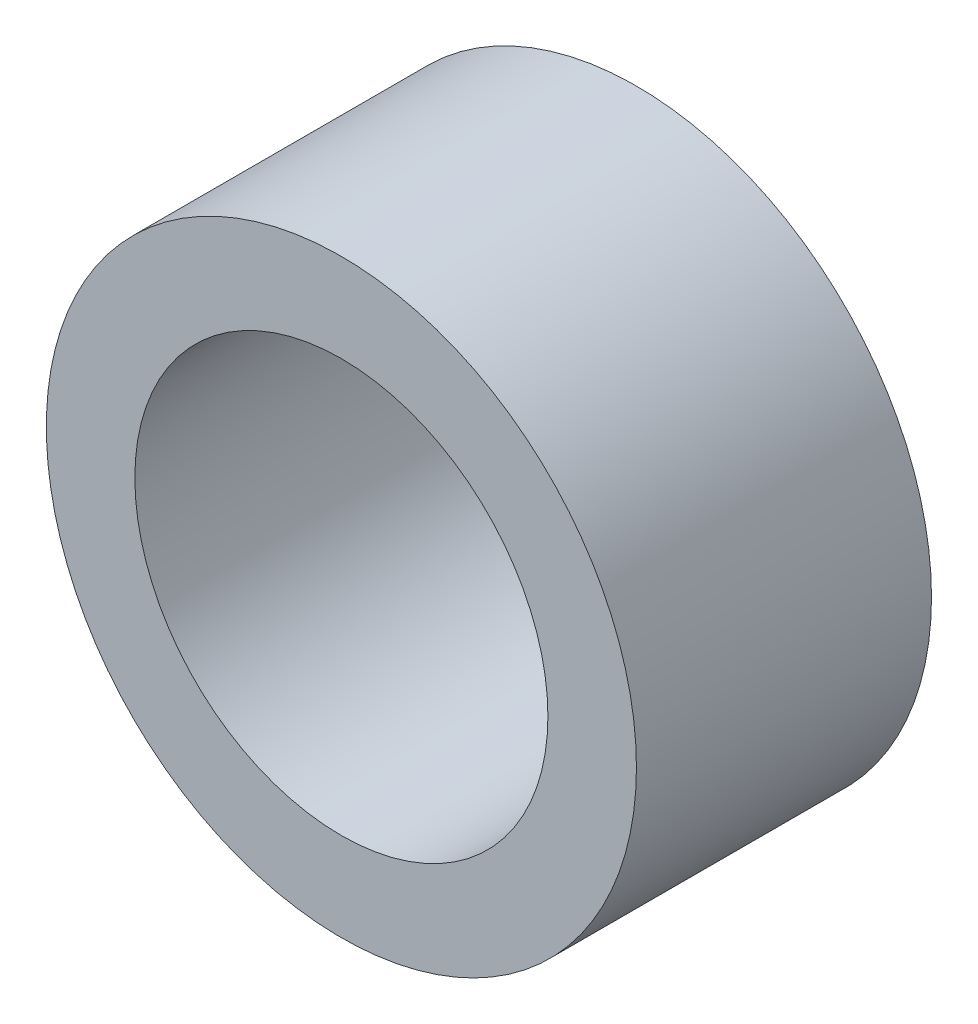
ISO-10303-21;
HEADER;
FILE_DESCRIPTION(('STEP AP214'),'2;1');
FILE_NAME('part.step','',(''),(''),'','','');
FILE_SCHEMA(('AUTOMOTIVE_DESIGN { 1 0 10303 214 1 1 1 1 }'));
ENDSEC;
DATA;
#1=APPLICATION_CONTEXT('core data for automotive mechanical design processes');
#2=APPLICATION_PROTOCOL_DEFINITION('international standard','automotive_design',2000,#1);
#3=PRODUCT_CONTEXT('',#1,'mechanical');
#4=PRODUCT('Part','Part','',(#3));
#5=PRODUCT_RELATED_PRODUCT_CATEGORY('part','',(#4));
#6=PRODUCT_DEFINITION_FORMATION('','',#4);
#7=PRODUCT_DEFINITION_CONTEXT('part definition',#1,'design');
#8=PRODUCT_DEFINITION('design','',#6,#7);
#9=PRODUCT_DEFINITION_SHAPE('','',#8);
#10=(LENGTH_UNIT() NAMED_UNIT(*) SI_UNIT(.MILLI.,.METRE.));
#11=(NAMED_UNIT(*) PLANE_ANGLE_UNIT() SI_UNIT($,.RADIAN.));
#12=(NAMED_UNIT(*) SI_UNIT($,.STERADIAN.) SOLID_ANGLE_UNIT());
#13=UNCERTAINTY_MEASURE_WITH_UNIT(LENGTH_MEASURE(1.E-05),#10,'distance_accuracy_value','');
#14=(GEOMETRIC_REPRESENTATION_CONTEXT(3) GLOBAL_UNCERTAINTY_ASSIGNED_CONTEXT((#13)) GLOBAL_UNIT_ASSIGNED_CONTEXT((#10,
#11,#12)) REPRESENTATION_CONTEXT('',''));
#15=CARTESIAN_POINT('',(0.,0.,0.));
#16=DIRECTION('',(0.,0.,1.));
#17=DIRECTION('',(1.,0.,0.));
#18=AXIS2_PLACEMENT_3D('',#15,#16,#17);
#19=CARTESIAN_POINT('',(0.,0.,1.5));
#20=DIRECTION('',(0.,0.,1.));
#21=DIRECTION('',(1.,0.,0.));
#22=AXIS2_PLACEMENT_3D('',#19,#20,#21);
#23=PLANE('',#22);
#24=CARTESIAN_POINT('',(0.,0.,1.5));
#25=DIRECTION('',(0.,0.,1.));
#26=DIRECTION('',(1.,0.,0.));
#27=AXIS2_PLACEMENT_3D('',#24,#25,#26);
#28=CIRCLE('',#27,1.5);
#29=CARTESIAN_POINT('',(1.5,0.,1.5));
#30=VERTEX_POINT('',#29);
#31=EDGE_CURVE('E10',#30,#30,#28,.T.);
#32=ORIENTED_EDGE('',*,*,#31,.T.);
#33=EDGE_LOOP('',(#32));
#34=FACE_BOUND('',#33,.T.);
#35=CARTESIAN_POINT('',(0.,0.,1.5));
#36=DIRECTION('',(0.,0.,1.));
#37=DIRECTION('',(1.,0.,0.));
#38=AXIS2_PLACEMENT_3D('',#35,#36,#37);
#39=CIRCLE('',#38,1.05);
#40=CARTESIAN_POINT('',(1.05,0.,1.5));
#41=VERTEX_POINT('',#40);
#42=EDGE_CURVE('E48',#41,#41,#39,.T.);
#43=ORIENTED_EDGE('',*,*,#42,.F.);
#44=EDGE_LOOP('',(#43));
#45=FACE_BOUND('',#44,.T.);
#46=ADVANCED_FACE('F40',(#34,#45),#23,.T.);
#47=CARTESIAN_POINT('',(0.,0.,0.));
#48=DIRECTION('',(0.,0.,1.));
#49=DIRECTION('',(1.,0.,0.));
#50=AXIS2_PLACEMENT_3D('',#47,#48,#49);
#51=PLANE('',#50);
#52=CARTESIAN_POINT('',(0.,0.,0.));
#53=DIRECTION('',(0.,0.,1.));
#54=DIRECTION('',(1.,0.,0.));
#55=AXIS2_PLACEMENT_3D('',#52,#53,#54);
#56=CIRCLE('',#55,1.5);
#57=CARTESIAN_POINT('',(1.5,0.,0.));
#58=VERTEX_POINT('',#57);
#59=EDGE_CURVE('E41',#58,#58,#56,.T.);
#60=ORIENTED_EDGE('',*,*,#59,.F.);
#61=EDGE_LOOP('',(#60));
#62=FACE_BOUND('',#61,.T.);
#63=CARTESIAN_POINT('',(0.,0.,0.));
#64=DIRECTION('',(0.,0.,1.));
#65=DIRECTION('',(1.,0.,0.));
#66=AXIS2_PLACEMENT_3D('',#63,#64,#65);
#67=CIRCLE('',#66,1.05);
#68=CARTESIAN_POINT('',(1.05,0.,0.));
#69=VERTEX_POINT('',#68);
#70=EDGE_CURVE('E49',#69,#69,#67,.T.);
#71=ORIENTED_EDGE('',*,*,#70,.T.);
#72=EDGE_LOOP('',(#71));
#73=FACE_BOUND('',#72,.T.);
#74=ADVANCED_FACE('F58',(#62,#73),#51,.F.);
#75=CARTESIAN_POINT('',(0.,0.,1.5));
#76=DIRECTION('',(0.,0.,-1.));
#77=DIRECTION('',(-1.,0.,0.));
#78=AXIS2_PLACEMENT_3D('',#75,#76,#77);
#79=CYLINDRICAL_SURFACE('',#78,1.5);
#80=ORIENTED_EDGE('',*,*,#31,.F.);
#81=EDGE_LOOP('',(#80));
#82=FACE_BOUND('',#81,.T.);
#83=ORIENTED_EDGE('',*,*,#59,.T.);
#84=EDGE_LOOP('',(#83));
#85=FACE_BOUND('',#84,.T.);
#86=ADVANCED_FACE('F39',(#82,#85),#79,.T.);
#87=CARTESIAN_POINT('',(0.,0.,1.5));
#88=DIRECTION('',(0.,0.,-1.));
#89=DIRECTION('',(-1.,0.,0.));
#90=AXIS2_PLACEMENT_3D('',#87,#88,#89);
#91=CYLINDRICAL_SURFACE('',#90,1.05);
#92=ORIENTED_EDGE('',*,*,#42,.T.);
#93=EDGE_LOOP('',(#92));
#94=FACE_BOUND('',#93,.T.);
#95=ORIENTED_EDGE('',*,*,#70,.F.);
#96=EDGE_LOOP('',(#95));
#97=FACE_BOUND('',#96,.T.);
#98=ADVANCED_FACE('F57',(#94,#97),#91,.F.);
#99=CLOSED_SHELL('',(#46,#74,#86,#98));
#100=MANIFOLD_SOLID_BREP('B2',#99);
#101=ADVANCED_BREP_SHAPE_REPRESENTATION('',(#18,#100),#14);
#102=SHAPE_DEFINITION_REPRESENTATION(#9,#101);
ENDSEC;
END-ISO-10303-21;
